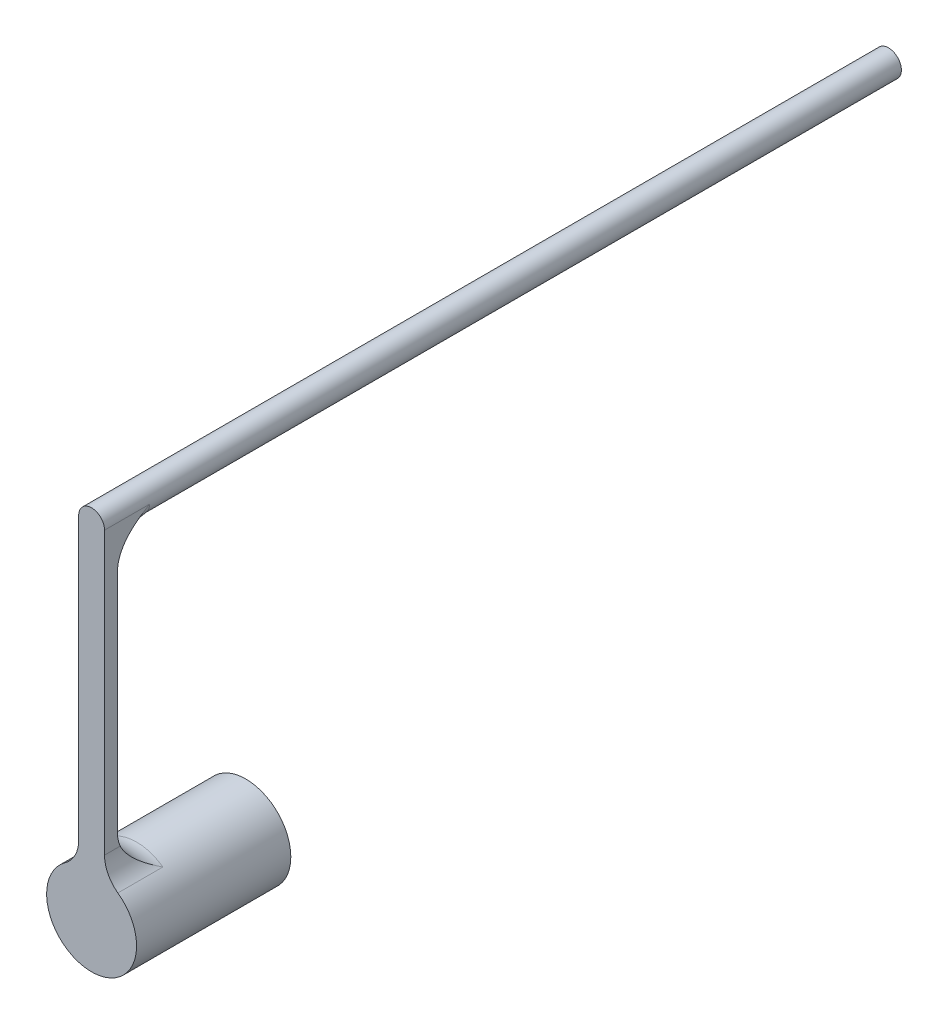
ISO-10303-21;
HEADER;
FILE_DESCRIPTION(('STEP AP214'),'2;1');
FILE_NAME('part.step','',(''),(''),'','','');
FILE_SCHEMA(('AUTOMOTIVE_DESIGN { 1 0 10303 214 1 1 1 1 }'));
ENDSEC;
DATA;
#1=APPLICATION_CONTEXT('core data for automotive mechanical design processes');
#2=APPLICATION_PROTOCOL_DEFINITION('international standard','automotive_design',2000,#1);
#3=PRODUCT_CONTEXT('',#1,'mechanical');
#4=PRODUCT('Part','Part','',(#3));
#5=PRODUCT_RELATED_PRODUCT_CATEGORY('part','',(#4));
#6=PRODUCT_DEFINITION_FORMATION('','',#4);
#7=PRODUCT_DEFINITION_CONTEXT('part definition',#1,'design');
#8=PRODUCT_DEFINITION('design','',#6,#7);
#9=PRODUCT_DEFINITION_SHAPE('','',#8);
#10=(LENGTH_UNIT() NAMED_UNIT(*) SI_UNIT(.MILLI.,.METRE.));
#11=(NAMED_UNIT(*) PLANE_ANGLE_UNIT() SI_UNIT($,.RADIAN.));
#12=(NAMED_UNIT(*) SI_UNIT($,.STERADIAN.) SOLID_ANGLE_UNIT());
#13=UNCERTAINTY_MEASURE_WITH_UNIT(LENGTH_MEASURE(1.E-05),#10,'distance_accuracy_value','');
#14=(GEOMETRIC_REPRESENTATION_CONTEXT(3) GLOBAL_UNCERTAINTY_ASSIGNED_CONTEXT((#13)) GLOBAL_UNIT_ASSIGNED_CONTEXT((#10,
#11,#12)) REPRESENTATION_CONTEXT('',''));
#15=CARTESIAN_POINT('',(0.,0.,0.));
#16=DIRECTION('',(0.,0.,1.));
#17=DIRECTION('',(1.,0.,0.));
#18=AXIS2_PLACEMENT_3D('',#15,#16,#17);
#19=CARTESIAN_POINT('',(0.,0.,22.));
#20=DIRECTION('',(0.,0.,1.));
#21=DIRECTION('',(1.,0.,0.));
#22=AXIS2_PLACEMENT_3D('',#19,#20,#21);
#23=PLANE('',#22);
#24=DIRECTION('',(0.,1.,0.));
#25=VECTOR('',#24,1.);
#26=CARTESIAN_POINT('',(-2.00951188529823,0.,22.));
#27=LINE('',#26,#25);
#28=CARTESIAN_POINT('',(-2.00951188529823,11.8305478310535,22.));
#29=VERTEX_POINT('',#28);
#30=CARTESIAN_POINT('',(-2.00951188529823,46.8162932614963,22.));
#31=VERTEX_POINT('',#30);
#32=EDGE_CURVE('E148',#29,#31,#27,.T.);
#33=ORIENTED_EDGE('',*,*,#32,.T.);
#34=CARTESIAN_POINT('',(0.,53.5315831921681,22.));
#35=DIRECTION('',(0.,0.,1.));
#36=DIRECTION('',(1.,0.,0.));
#37=AXIS2_PLACEMENT_3D('',#34,#35,#36);
#38=CIRCLE('',#37,7.00951188529823);
#39=CARTESIAN_POINT('',(2.00951188529823,46.8162932614963,22.));
#40=VERTEX_POINT('',#39);
#41=EDGE_CURVE('E70',#31,#40,#38,.T.);
#42=ORIENTED_EDGE('',*,*,#41,.T.);
#43=DIRECTION('',(0.,1.,0.));
#44=VECTOR('',#43,1.);
#45=CARTESIAN_POINT('',(2.00951188529823,0.,22.));
#46=LINE('',#45,#44);
#47=CARTESIAN_POINT('',(2.00951188529823,11.8305478310535,22.));
#48=VERTEX_POINT('',#47);
#49=EDGE_CURVE('E146',#48,#40,#46,.T.);
#50=ORIENTED_EDGE('',*,*,#49,.F.);
#51=CARTESIAN_POINT('',(0.,0.,22.));
#52=DIRECTION('',(0.,0.,1.));
#53=DIRECTION('',(1.,0.,0.));
#54=AXIS2_PLACEMENT_3D('',#51,#52,#53);
#55=CIRCLE('',#54,12.);
#56=EDGE_CURVE('E154',#48,#29,#55,.T.);
#57=ORIENTED_EDGE('',*,*,#56,.T.);
#58=EDGE_LOOP('',(#33,#42,#50,#57));
#59=FACE_BOUND('',#58,.T.);
#60=ADVANCED_FACE('F43',(#59),#23,.F.);
#61=CARTESIAN_POINT('',(0.,0.,22.));
#62=DIRECTION('',(0.,0.,-1.));
#63=DIRECTION('',(-1.,0.,0.));
#64=AXIS2_PLACEMENT_3D('',#61,#62,#63);
#65=CYLINDRICAL_SURFACE('',#64,7.);
#66=CARTESIAN_POINT('',(0.,0.,17.));
#67=DIRECTION('',(0.,0.,1.));
#68=DIRECTION('',(1.,0.,0.));
#69=AXIS2_PLACEMENT_3D('',#66,#67,#68);
#70=CIRCLE('',#69,7.);
#71=CARTESIAN_POINT('',(-4.08888193309063,5.68164100742426,17.));
#72=VERTEX_POINT('',#71);
#73=CARTESIAN_POINT('',(4.08888193309063,5.68164100742426,17.));
#74=VERTEX_POINT('',#73);
#75=EDGE_CURVE('E157',#72,#74,#70,.F.);
#76=ORIENTED_EDGE('',*,*,#75,.T.);
#77=DIRECTION('',(0.,0.,-1.));
#78=VECTOR('',#77,1.);
#79=CARTESIAN_POINT('',(4.08888193309063,5.68164100742427,22.));
#80=LINE('',#79,#78);
#81=CARTESIAN_POINT('',(4.08888193309063,5.68164100742426,24.));
#82=VERTEX_POINT('',#81);
#83=EDGE_CURVE('E220',#74,#82,#80,.F.);
#84=ORIENTED_EDGE('',*,*,#83,.T.);
#85=CARTESIAN_POINT('',(0.,0.,24.));
#86=DIRECTION('',(0.,0.,1.));
#87=DIRECTION('',(1.,0.,0.));
#88=AXIS2_PLACEMENT_3D('',#85,#86,#87);
#89=CIRCLE('',#88,7.);
#90=CARTESIAN_POINT('',(-4.08888193309063,5.68164100742426,24.));
#91=VERTEX_POINT('',#90);
#92=EDGE_CURVE('E128',#91,#82,#89,.T.);
#93=ORIENTED_EDGE('',*,*,#92,.F.);
#94=DIRECTION('',(0.,0.,-1.));
#95=VECTOR('',#94,1.);
#96=CARTESIAN_POINT('',(-4.08888193309063,5.68164100742427,22.));
#97=LINE('',#96,#95);
#98=EDGE_CURVE('E222',#91,#72,#97,.T.);
#99=ORIENTED_EDGE('',*,*,#98,.T.);
#100=EDGE_LOOP('',(#76,#84,#93,#99));
#101=FACE_BOUND('',#100,.T.);
#102=CARTESIAN_POINT('',(0.,0.,0.));
#103=DIRECTION('',(0.,0.,1.));
#104=DIRECTION('',(1.,0.,0.));
#105=AXIS2_PLACEMENT_3D('',#102,#103,#104);
#106=CIRCLE('',#105,7.);
#107=CARTESIAN_POINT('',(7.,0.,0.));
#108=VERTEX_POINT('',#107);
#109=EDGE_CURVE('E136',#108,#108,#106,.T.);
#110=ORIENTED_EDGE('',*,*,#109,.T.);
#111=EDGE_LOOP('',(#110));
#112=FACE_BOUND('',#111,.T.);
#113=ADVANCED_FACE('F234',(#101,#112),#65,.T.);
#114=CARTESIAN_POINT('',(0.,0.,0.));
#115=DIRECTION('',(0.,0.,1.));
#116=DIRECTION('',(1.,0.,0.));
#117=AXIS2_PLACEMENT_3D('',#114,#115,#116);
#118=PLANE('',#117);
#119=ORIENTED_EDGE('',*,*,#109,.F.);
#120=EDGE_LOOP('',(#119));
#121=FACE_BOUND('',#120,.T.);
#122=ADVANCED_FACE('F245',(#121),#118,.F.);
#123=CARTESIAN_POINT('',(2.00951188529823,0.,24.));
#124=DIRECTION('',(-1.,0.,0.));
#125=DIRECTION('',(0.,0.,1.));
#126=AXIS2_PLACEMENT_3D('',#123,#124,#125);
#127=PLANE('',#126);
#128=DIRECTION('',(0.,1.,0.));
#129=VECTOR('',#128,1.);
#130=CARTESIAN_POINT('',(2.00951188529823,0.,24.));
#131=LINE('',#130,#129);
#132=CARTESIAN_POINT('',(2.00951188529823,9.73995601272731,24.));
#133=VERTEX_POINT('',#132);
#134=CARTESIAN_POINT('',(2.00951188529823,53.5315831921681,24.));
#135=VERTEX_POINT('',#134);
#136=EDGE_CURVE('E115',#133,#135,#131,.T.);
#137=ORIENTED_EDGE('',*,*,#136,.F.);
#138=DIRECTION('',(0.,0.,1.));
#139=VECTOR('',#138,1.);
#140=CARTESIAN_POINT('',(2.00951188529823,9.73995601272731,17.));
#141=LINE('',#140,#139);
#142=CARTESIAN_POINT('',(2.00951188529823,9.73995601272731,21.5582187899679));
#143=VERTEX_POINT('',#142);
#144=EDGE_CURVE('E224',#133,#143,#141,.F.);
#145=ORIENTED_EDGE('',*,*,#144,.T.);
#146=CARTESIAN_POINT('',(2.00951188529823,6.70536068998866,17.));
#147=CARTESIAN_POINT('',(2.00951188529823,6.7053392372978,17.1371448207997));
#148=CARTESIAN_POINT('',(2.00951188529823,6.71125038985025,17.2742834043203));
#149=CARTESIAN_POINT('',(2.00951188529823,6.73477941582557,17.5475279949485));
#150=CARTESIAN_POINT('',(2.00951188529823,6.75239511962088,17.6836341886979));
#151=CARTESIAN_POINT('',(2.00951188529823,6.79912287511089,17.9535451484812));
#152=CARTESIAN_POINT('',(2.00951188529823,6.82820928536825,18.0873543576966));
#153=CARTESIAN_POINT('',(2.00951188529823,6.89758180299015,18.3520347887558));
#154=CARTESIAN_POINT('',(2.00951188529823,6.93786810567122,18.4829059593198));
#155=CARTESIAN_POINT('',(2.00951188529823,7.02924737732952,18.7407643921577));
#156=CARTESIAN_POINT('',(2.00951188529823,7.08033585856832,18.8677532423328));
#157=CARTESIAN_POINT('',(2.00951188529823,7.19286337114372,19.117075468538));
#158=CARTESIAN_POINT('',(2.00951188529823,7.25430623962204,19.2394070980108));
#159=CARTESIAN_POINT('',(2.00951188529823,7.45341703411276,19.5981840364216));
#160=CARTESIAN_POINT('',(2.00951188529823,7.60593380619595,19.8265979932329));
#161=CARTESIAN_POINT('',(2.00951188529823,7.94969051314372,20.2609654316838));
#162=CARTESIAN_POINT('',(2.00951188529823,8.14177251232586,20.4662477013513));
#163=CARTESIAN_POINT('',(2.00951188529823,8.55675994382166,20.8429592499007));
#164=CARTESIAN_POINT('',(2.00951188529823,8.77967275715286,21.014380398364));
#165=CARTESIAN_POINT('',(2.00951188529823,9.25778831918449,21.323924905458));
#166=CARTESIAN_POINT('',(2.00951188529823,9.51379885059548,21.4608003851049));
#167=CARTESIAN_POINT('',(2.00951188529823,10.0449650692985,21.6900621875949));
#168=CARTESIAN_POINT('',(2.00951188529823,10.3201121226781,21.7824684267044));
#169=CARTESIAN_POINT('',(2.00951188529823,10.802027551927,21.9006067844547));
#170=CARTESIAN_POINT('',(2.00951188529823,11.0060579193773,21.9378156126337));
#171=CARTESIAN_POINT('',(2.00951188529823,11.4168775839576,21.9875182635711));
#172=CARTESIAN_POINT('',(2.00951188529823,11.623663621053,22.0000390613728));
#173=CARTESIAN_POINT('',(2.00951188529823,11.8305478310535,22.));
#174=B_SPLINE_CURVE_WITH_KNOTS('',3,(#146,#147,#148,#149,#150,#151,#152,#153,#154,#155,#156,
#157,#158,#159,#160,#161,#162,#163,#164,#165,#166,#167,#168,#169,#170,#171,#172,#173),
.UNSPECIFIED.,.F.,.F.,(4,2,2,2,2,2,2,2,2,2,2,2,2,4),(0.,0.411297469220054,0.822518719074642,
1.23282589500662,1.64314022679324,2.05328442826581,2.46358095707416,3.28358677970923,
4.12328731619701,4.96318922937036,5.83009721603543,6.69661658181093,7.31738700369939,
7.93747877247301),.UNSPECIFIED.);
#175=EDGE_CURVE('E168',#143,#48,#174,.T.);
#176=ORIENTED_EDGE('',*,*,#175,.T.);
#177=ORIENTED_EDGE('',*,*,#49,.T.);
#178=CARTESIAN_POINT('',(2.00951188529823,46.8162932614963,22.));
#179=CARTESIAN_POINT('',(2.00951188529823,46.9651802013113,22.0000182785987));
#180=CARTESIAN_POINT('',(2.00951188529823,47.1140446181115,21.9938977364108));
#181=CARTESIAN_POINT('',(2.00951188529823,47.4107329238045,21.9697189781962));
#182=CARTESIAN_POINT('',(2.00951188529823,47.5585572742733,21.9516664460712));
#183=CARTESIAN_POINT('',(2.00951188529823,47.8517151594849,21.904060214657));
#184=CARTESIAN_POINT('',(2.00951188529823,47.9970563876834,21.8745536651664));
#185=CARTESIAN_POINT('',(2.00951188529823,48.285060057779,21.8044824645501));
#186=CARTESIAN_POINT('',(2.00951188529823,48.4277221328164,21.7639163106512));
#187=CARTESIAN_POINT('',(2.00951188529823,48.7195221642596,21.6690295780712));
#188=CARTESIAN_POINT('',(2.00951188529823,48.8684109899462,21.6139429385729));
#189=CARTESIAN_POINT('',(2.00951188529823,49.1615361978369,21.4924224985299));
#190=CARTESIAN_POINT('',(2.00951188529823,49.3057707144348,21.4259842134076));
#191=CARTESIAN_POINT('',(2.00951188529823,49.5889814550239,21.2825526592121));
#192=CARTESIAN_POINT('',(2.00951188529823,49.7279547518596,21.2055536215142));
#193=CARTESIAN_POINT('',(2.00951188529823,50.0001102549599,21.0419035317173));
#194=CARTESIAN_POINT('',(2.00951188529823,50.1332911674281,20.9552503384884));
#195=CARTESIAN_POINT('',(2.00951188529823,50.4579669388046,20.7281409851349));
#196=CARTESIAN_POINT('',(2.00951188529823,50.6457014970891,20.5822815329115));
#197=CARTESIAN_POINT('',(2.00951188529823,51.0072186103486,20.2741889196083));
#198=CARTESIAN_POINT('',(2.00951188529823,51.180994559566,20.1119480872389));
#199=CARTESIAN_POINT('',(2.00951188529823,51.5153895540018,19.7740207571558));
#200=CARTESIAN_POINT('',(2.00951188529823,51.6759876211979,19.5983136503671));
#201=CARTESIAN_POINT('',(2.00951188529823,51.9851171101475,19.236727798863));
#202=CARTESIAN_POINT('',(2.00951188529823,52.1336504325943,19.0508506640974));
#203=CARTESIAN_POINT('',(2.00951188529823,52.3894595171032,18.7131346800647));
#204=CARTESIAN_POINT('',(2.00951188529823,52.498657772072,18.5627345912863));
#205=CARTESIAN_POINT('',(2.00951188529823,52.7121979341951,18.2588204329733));
#206=CARTESIAN_POINT('',(2.00951188529823,52.8165457031403,18.1053104619793));
#207=CARTESIAN_POINT('',(2.00951188529823,53.0222619346161,17.7957155862569));
#208=CARTESIAN_POINT('',(2.00951188529823,53.1236214126734,17.6396247602837));
#209=CARTESIAN_POINT('',(2.00951188529823,53.3246649936266,17.3263417598605));
#210=CARTESIAN_POINT('',(2.00951188529823,53.4243488384703,17.1691494209612));
#211=CARTESIAN_POINT('',(2.00951188529823,53.5265351252475,17.0079627822383));
#212=CARTESIAN_POINT('',(2.00951188529823,53.5290591589441,17.0039813909896));
#213=CARTESIAN_POINT('',(2.00951188529823,53.5315831921681,17.));
#214=B_SPLINE_CURVE_WITH_KNOTS('',3,(#178,#179,#180,#181,#182,#183,#184,#185,#186,#187,#188,
#189,#190,#191,#192,#193,#194,#195,#196,#197,#198,#199,#200,#201,#202,#203,#204,#205,#206,#207,
#208,#209,#210,#211,#212,#213),.UNSPECIFIED.,.F.,.F.,(4,2,2,2,2,2,2,2,2,2,2,2,2,2,2,2,2,4),(0.,
0.44650168366655,0.892790825722232,1.33726199971908,1.78179359835032,2.25755403744044,
2.73350286673235,3.2097127178186,3.68602839530366,4.3980753142959,5.1104572403399,
5.82395206045977,6.53733425690686,7.09481322302693,7.65159996414811,8.20991822147486,
8.76832168779993,8.78246382342356),.UNSPECIFIED.);
#215=CARTESIAN_POINT('',(2.00951188529823,53.5315831921681,17.));
#216=VERTEX_POINT('',#215);
#217=EDGE_CURVE('E11',#40,#216,#214,.T.);
#218=ORIENTED_EDGE('',*,*,#217,.T.);
#219=DIRECTION('',(0.,0.,-1.));
#220=VECTOR('',#219,1.);
#221=CARTESIAN_POINT('',(2.00951188529823,53.5315831921681,24.));
#222=LINE('',#221,#220);
#223=EDGE_CURVE('E130',#135,#216,#222,.T.);
#224=ORIENTED_EDGE('',*,*,#223,.F.);
#225=EDGE_LOOP('',(#137,#145,#176,#177,#218,#224));
#226=FACE_BOUND('',#225,.T.);
#227=ADVANCED_FACE('F131',(#226),#127,.F.);
#228=CARTESIAN_POINT('',(0.,53.5315831921681,24.));
#229=DIRECTION('',(0.,0.,-1.));
#230=DIRECTION('',(-1.,0.,0.));
#231=AXIS2_PLACEMENT_3D('',#228,#229,#230);
#232=CYLINDRICAL_SURFACE('',#231,2.00951188529823);
#233=CARTESIAN_POINT('',(0.,53.5315831921681,17.));
#234=DIRECTION('',(0.,0.,1.));
#235=DIRECTION('',(1.,0.,0.));
#236=AXIS2_PLACEMENT_3D('',#233,#234,#235);
#237=CIRCLE('',#236,2.00951188529823);
#238=CARTESIAN_POINT('',(-2.00951188529823,53.5315831921681,17.));
#239=VERTEX_POINT('',#238);
#240=EDGE_CURVE('E191',#216,#239,#237,.F.);
#241=ORIENTED_EDGE('',*,*,#240,.T.);
#242=DIRECTION('',(0.,0.,-1.));
#243=VECTOR('',#242,1.);
#244=CARTESIAN_POINT('',(-2.00951188529823,53.5315831921681,24.));
#245=LINE('',#244,#243);
#246=CARTESIAN_POINT('',(-2.00951188529823,53.5315831921681,24.));
#247=VERTEX_POINT('',#246);
#248=EDGE_CURVE('E137',#247,#239,#245,.T.);
#249=ORIENTED_EDGE('',*,*,#248,.F.);
#250=CARTESIAN_POINT('',(0.,53.5315831921681,24.));
#251=DIRECTION('',(0.,0.,1.));
#252=DIRECTION('',(1.,0.,0.));
#253=AXIS2_PLACEMENT_3D('',#250,#251,#252);
#254=CIRCLE('',#253,2.00951188529823);
#255=EDGE_CURVE('E120',#135,#247,#254,.T.);
#256=ORIENTED_EDGE('',*,*,#255,.F.);
#257=ORIENTED_EDGE('',*,*,#223,.T.);
#258=EDGE_LOOP('',(#241,#249,#256,#257));
#259=FACE_BOUND('',#258,.T.);
#260=CARTESIAN_POINT('',(0.,53.5315831921681,-100.));
#261=DIRECTION('',(0.,0.,-1.));
#262=DIRECTION('',(-1.,0.,0.));
#263=AXIS2_PLACEMENT_3D('',#260,#261,#262);
#264=CIRCLE('',#263,2.00951188529823);
#265=CARTESIAN_POINT('',(-2.00951188529823,53.5315831921681,-100.));
#266=VERTEX_POINT('',#265);
#267=EDGE_CURVE('E149',#266,#266,#264,.T.);
#268=ORIENTED_EDGE('',*,*,#267,.F.);
#269=EDGE_LOOP('',(#268));
#270=FACE_BOUND('',#269,.T.);
#271=ADVANCED_FACE('F139',(#259,#270),#232,.T.);
#272=CARTESIAN_POINT('',(-2.00951188529823,0.,24.));
#273=DIRECTION('',(-1.,0.,0.));
#274=DIRECTION('',(0.,0.,1.));
#275=AXIS2_PLACEMENT_3D('',#272,#273,#274);
#276=PLANE('',#275);
#277=CARTESIAN_POINT('',(-2.00951188529823,11.8305478310535,22.));
#278=CARTESIAN_POINT('',(-2.00951188529823,11.6848424065092,22.0000150454789));
#279=CARTESIAN_POINT('',(-2.00951188529823,11.5391425123131,21.9938102554616));
#280=CARTESIAN_POINT('',(-2.00951188529823,11.2488011779917,21.9691100152312));
#281=CARTESIAN_POINT('',(-2.00951188529823,11.1041596400672,21.9506157155297));
#282=CARTESIAN_POINT('',(-2.00951188529823,10.8170782094431,21.9015065339501));
#283=CARTESIAN_POINT('',(-2.00951188529823,10.6746365307952,21.8709020864033));
#284=CARTESIAN_POINT('',(-2.00951188529823,10.392832289639,21.797821342587));
#285=CARTESIAN_POINT('',(-2.00951188529823,10.2534697339033,21.7553450202078));
#286=CARTESIAN_POINT('',(-2.00951188529823,9.97879409044017,21.6588348434431));
#287=CARTESIAN_POINT('',(-2.00951188529823,9.84348131351386,21.6048001045837));
#288=CARTESIAN_POINT('',(-2.00951188529823,9.57781908661484,21.4855431370995));
#289=CARTESIAN_POINT('',(-2.00951188529823,9.44747148451542,21.420316792093));
#290=CARTESIAN_POINT('',(-2.00951188529823,9.19276566106843,21.2791752251419));
#291=CARTESIAN_POINT('',(-2.00951188529823,9.06840506421996,21.2032642902871));
#292=CARTESIAN_POINT('',(-2.00951188529823,8.82646539276881,21.0412249465636));
#293=CARTESIAN_POINT('',(-2.00951188529823,8.70888868193018,20.9550930078816));
#294=CARTESIAN_POINT('',(-2.00951188529823,8.48113107775117,20.7729800472233));
#295=CARTESIAN_POINT('',(-2.00951188529823,8.37096988217411,20.6769743832205));
#296=CARTESIAN_POINT('',(-2.00951188529823,8.15920928888225,20.4759448864012));
#297=CARTESIAN_POINT('',(-2.00951188529823,8.05760974933416,20.3709212030364));
#298=CARTESIAN_POINT('',(-2.00951188529823,7.86373100063415,20.1525174819902));
#299=CARTESIAN_POINT('',(-2.00951188529823,7.77145558492566,20.039134075413));
#300=CARTESIAN_POINT('',(-2.00951188529823,7.59707008785311,19.8048669080883));
#301=CARTESIAN_POINT('',(-2.00951188529823,7.51495603560633,19.6839861050914));
#302=CARTESIAN_POINT('',(-2.00951188529823,7.36270409103407,19.437360675783));
#303=CARTESIAN_POINT('',(-2.00951188529823,7.29240738361286,19.3117141179461));
#304=CARTESIAN_POINT('',(-2.00951188529823,7.16300369273962,19.0548468624597));
#305=CARTESIAN_POINT('',(-2.00951188529823,7.10389202912837,18.9236285244775));
#306=CARTESIAN_POINT('',(-2.00951188529823,6.99743616430756,18.6566178374371));
#307=CARTESIAN_POINT('',(-2.00951188529823,6.95008266135496,18.520829201084));
#308=CARTESIAN_POINT('',(-2.00951188529823,6.86757888623074,18.2456471121353));
#309=CARTESIAN_POINT('',(-2.00951188529823,6.83242437688654,18.1062549293));
#310=CARTESIAN_POINT('',(-2.00951188529823,6.77096714994786,17.8067515847155));
#311=CARTESIAN_POINT('',(-2.00951188529823,6.7463871114314,17.6462837264975));
#312=CARTESIAN_POINT('',(-2.00951188529823,6.71357144322234,17.323876643618));
#313=CARTESIAN_POINT('',(-2.00951188529823,6.70531682590295,17.1619393485955));
#314=CARTESIAN_POINT('',(-2.00951188529823,6.70536068998866,17.));
#315=B_SPLINE_CURVE_WITH_KNOTS('',3,(#277,#278,#279,#280,#281,#282,#283,#284,#285,#286,#287,
#288,#289,#290,#291,#292,#293,#294,#295,#296,#297,#298,#299,#300,#301,#302,#303,#304,#305,#306,
#307,#308,#309,#310,#311,#312,#313,#314),.UNSPECIFIED.,.F.,.F.,(4,2,2,2,2,2,2,2,2,2,2,2,2,2,2,2,
2,2,4),(0.,0.436976283398089,0.873911663992481,1.31047138974169,1.74703207561416,
2.18362617996365,2.62038121346726,3.05696150011656,3.49369300052695,3.93154220155706,
4.36938414770467,4.80740351505567,5.2452511679181,5.67663911618605,6.10784615763691,
6.53871098160111,6.96942599974092,7.45560207086539,7.94121235129992),.UNSPECIFIED.);
#316=CARTESIAN_POINT('',(-2.00951188529823,9.73995601272686,21.5582187899677));
#317=VERTEX_POINT('',#316);
#318=EDGE_CURVE('E159',#29,#317,#315,.T.);
#319=ORIENTED_EDGE('',*,*,#318,.T.);
#320=DIRECTION('',(0.,0.,-1.));
#321=VECTOR('',#320,1.);
#322=CARTESIAN_POINT('',(-2.00951188529823,9.73995601272731,24.));
#323=LINE('',#322,#321);
#324=CARTESIAN_POINT('',(-2.00951188529823,9.73995601272731,24.));
#325=VERTEX_POINT('',#324);
#326=EDGE_CURVE('E218',#317,#325,#323,.F.);
#327=ORIENTED_EDGE('',*,*,#326,.T.);
#328=DIRECTION('',(0.,1.,0.));
#329=VECTOR('',#328,1.);
#330=CARTESIAN_POINT('',(-2.00951188529823,0.,24.));
#331=LINE('',#330,#329);
#332=EDGE_CURVE('E141',#325,#247,#331,.T.);
#333=ORIENTED_EDGE('',*,*,#332,.T.);
#334=ORIENTED_EDGE('',*,*,#248,.T.);
#335=CARTESIAN_POINT('',(-2.00951188529823,46.8162932614963,22.));
#336=CARTESIAN_POINT('',(-2.00951188529823,46.9651802013113,22.0000182785987));
#337=CARTESIAN_POINT('',(-2.00951188529823,47.1140446181115,21.9938977364108));
#338=CARTESIAN_POINT('',(-2.00951188529823,47.4107329238045,21.9697189781962));
#339=CARTESIAN_POINT('',(-2.00951188529823,47.5585572742733,21.9516664460712));
#340=CARTESIAN_POINT('',(-2.00951188529823,47.8517151594849,21.904060214657));
#341=CARTESIAN_POINT('',(-2.00951188529823,47.9970563876834,21.8745536651664));
#342=CARTESIAN_POINT('',(-2.00951188529823,48.285060057779,21.8044824645501));
#343=CARTESIAN_POINT('',(-2.00951188529823,48.4277221328164,21.7639163106512));
#344=CARTESIAN_POINT('',(-2.00951188529823,48.7195221642596,21.6690295780712));
#345=CARTESIAN_POINT('',(-2.00951188529823,48.8684109899462,21.6139429385729));
#346=CARTESIAN_POINT('',(-2.00951188529823,49.1615361978369,21.4924224985299));
#347=CARTESIAN_POINT('',(-2.00951188529823,49.3057707144348,21.4259842134076));
#348=CARTESIAN_POINT('',(-2.00951188529823,49.5889814550239,21.2825526592121));
#349=CARTESIAN_POINT('',(-2.00951188529823,49.7279547518596,21.2055536215142));
#350=CARTESIAN_POINT('',(-2.00951188529823,50.0001102549599,21.0419035317173));
#351=CARTESIAN_POINT('',(-2.00951188529823,50.1332911674281,20.9552503384884));
#352=CARTESIAN_POINT('',(-2.00951188529823,50.4579669388046,20.7281409851349));
#353=CARTESIAN_POINT('',(-2.00951188529823,50.6457014970891,20.5822815329115));
#354=CARTESIAN_POINT('',(-2.00951188529823,51.0072186103486,20.2741889196083));
#355=CARTESIAN_POINT('',(-2.00951188529823,51.180994559566,20.1119480872389));
#356=CARTESIAN_POINT('',(-2.00951188529823,51.5153895540018,19.7740207571558));
#357=CARTESIAN_POINT('',(-2.00951188529823,51.6759876211979,19.5983136503671));
#358=CARTESIAN_POINT('',(-2.00951188529823,51.9851171101475,19.236727798863));
#359=CARTESIAN_POINT('',(-2.00951188529823,52.1336504325943,19.0508506640974));
#360=CARTESIAN_POINT('',(-2.00951188529823,52.3894595171032,18.7131346800647));
#361=CARTESIAN_POINT('',(-2.00951188529823,52.498657772072,18.5627345912863));
#362=CARTESIAN_POINT('',(-2.00951188529823,52.7121979341951,18.2588204329733));
#363=CARTESIAN_POINT('',(-2.00951188529823,52.8165457031403,18.1053104619793));
#364=CARTESIAN_POINT('',(-2.00951188529823,53.0222619346161,17.7957155862569));
#365=CARTESIAN_POINT('',(-2.00951188529823,53.1236214126734,17.6396247602837));
#366=CARTESIAN_POINT('',(-2.00951188529823,53.3246649936266,17.3263417598605));
#367=CARTESIAN_POINT('',(-2.00951188529823,53.4243488384703,17.1691494209612));
#368=CARTESIAN_POINT('',(-2.00951188529823,53.5265351252475,17.0079627822383));
#369=CARTESIAN_POINT('',(-2.00951188529823,53.5290591589441,17.0039813909896));
#370=CARTESIAN_POINT('',(-2.00951188529823,53.5315831921681,17.));
#371=B_SPLINE_CURVE_WITH_KNOTS('',3,(#335,#336,#337,#338,#339,#340,#341,#342,#343,#344,#345,
#346,#347,#348,#349,#350,#351,#352,#353,#354,#355,#356,#357,#358,#359,#360,#361,#362,#363,#364,
#365,#366,#367,#368,#369,#370),.UNSPECIFIED.,.F.,.F.,(4,2,2,2,2,2,2,2,2,2,2,2,2,2,2,2,2,4),(0.,
0.44650168366655,0.892790825722232,1.33726199971908,1.78179359835032,2.25755403744044,
2.73350286673235,3.2097127178186,3.68602839530366,4.3980753142959,5.1104572403399,
5.82395206045977,6.53733425690686,7.09481322302693,7.65159996414811,8.20991822147486,
8.76832168779993,8.78246382342356),.UNSPECIFIED.);
#372=EDGE_CURVE('E57',#239,#31,#371,.F.);
#373=ORIENTED_EDGE('',*,*,#372,.T.);
#374=ORIENTED_EDGE('',*,*,#32,.F.);
#375=EDGE_LOOP('',(#319,#327,#333,#334,#373,#374));
#376=FACE_BOUND('',#375,.T.);
#377=ADVANCED_FACE('F178',(#376),#276,.T.);
#378=CARTESIAN_POINT('',(0.,0.,24.));
#379=DIRECTION('',(0.,0.,1.));
#380=DIRECTION('',(1.,0.,0.));
#381=AXIS2_PLACEMENT_3D('',#378,#379,#380);
#382=PLANE('',#381);
#383=ORIENTED_EDGE('',*,*,#332,.F.);
#384=CARTESIAN_POINT('',(-7.00951188529823,9.73995601272731,24.));
#385=DIRECTION('',(0.,0.,1.));
#386=DIRECTION('',(1.,0.,0.));
#387=AXIS2_PLACEMENT_3D('',#384,#385,#386);
#388=CIRCLE('',#387,5.);
#389=EDGE_CURVE('E193',#325,#91,#388,.F.);
#390=ORIENTED_EDGE('',*,*,#389,.T.);
#391=ORIENTED_EDGE('',*,*,#92,.T.);
#392=CARTESIAN_POINT('',(7.00951188529823,9.73995601272731,24.));
#393=DIRECTION('',(0.,0.,1.));
#394=DIRECTION('',(1.,0.,0.));
#395=AXIS2_PLACEMENT_3D('',#392,#393,#394);
#396=CIRCLE('',#395,5.);
#397=EDGE_CURVE('E124',#82,#133,#396,.F.);
#398=ORIENTED_EDGE('',*,*,#397,.T.);
#399=ORIENTED_EDGE('',*,*,#136,.T.);
#400=ORIENTED_EDGE('',*,*,#255,.T.);
#401=EDGE_LOOP('',(#383,#390,#391,#398,#399,#400));
#402=FACE_BOUND('',#401,.T.);
#403=ADVANCED_FACE('F118',(#402),#382,.T.);
#404=CARTESIAN_POINT('',(0.,0.,17.));
#405=DIRECTION('',(0.,0.,1.));
#406=DIRECTION('',(1.,0.,0.));
#407=AXIS2_PLACEMENT_3D('',#404,#405,#406);
#408=TOROIDAL_SURFACE('',#407,12.,5.);
#409=ORIENTED_EDGE('',*,*,#175,.F.);
#410=CARTESIAN_POINT('',(2.00951188529823,9.73995601272731,21.5582187899679));
#411=CARTESIAN_POINT('',(2.00950388365162,9.60190506149211,21.4973103478148));
#412=CARTESIAN_POINT('',(2.01522644193257,9.46649540928433,21.4308227873632));
#413=CARTESIAN_POINT('',(2.03676454705383,9.20208573145015,21.2882333926709));
#414=CARTESIAN_POINT('',(2.05255477282021,9.07307049814632,21.2121560615873));
#415=CARTESIAN_POINT('',(2.09261997709013,8.82345668709834,21.0526217647854));
#416=CARTESIAN_POINT('',(2.11678574625915,8.70277266147484,20.9692696455501));
#417=CARTESIAN_POINT('',(2.17243964313968,8.46823844135109,20.7955602977348));
#418=CARTESIAN_POINT('',(2.20393323961557,8.35439343104827,20.7051978710953));
#419=CARTESIAN_POINT('',(2.28670959510225,8.09038763141767,20.4820763539142));
#420=CARTESIAN_POINT('',(2.34091233667395,7.9434626176218,20.3465712349008));
#421=CARTESIAN_POINT('',(2.45898761917344,7.6624648832512,20.0667913454866));
#422=CARTESIAN_POINT('',(2.52286351368625,7.52839664642246,19.9225135441073));
#423=CARTESIAN_POINT('',(2.65883874532523,7.27158493147301,19.6265382088195));
#424=CARTESIAN_POINT('',(2.73097738486079,7.14890106517497,19.4748073549873));
#425=CARTESIAN_POINT('',(2.88193384275659,6.91462176486316,19.1663235778512));
#426=CARTESIAN_POINT('',(2.96074990137505,6.80302342614989,19.0095719844247));
#427=CARTESIAN_POINT('',(3.11912587325015,6.596592457812,18.7023496324101));
#428=CARTESIAN_POINT('',(3.19832759831602,6.50114690380075,18.5521034422174));
#429=CARTESIAN_POINT('',(3.36135550782434,6.31856715498255,18.2496234610577));
#430=CARTESIAN_POINT('',(3.44517172835036,6.23141608167781,18.0973944555821));
#431=CARTESIAN_POINT('',(3.61829910620442,6.06377014269454,17.7899157149148));
#432=CARTESIAN_POINT('',(3.7076573282124,5.98335165185525,17.6346510010321));
#433=CARTESIAN_POINT('',(3.891159955579,5.82968691248015,17.3233333034608));
#434=CARTESIAN_POINT('',(3.98530546605214,5.75644233151823,17.1672801453216));
#435=CARTESIAN_POINT('',(4.08423852725511,5.68498573948496,17.0074926757898));
#436=CARTESIAN_POINT('',(4.0865595182919,5.68331237620615,17.0037463317381));
#437=CARTESIAN_POINT('',(4.08888193309063,5.68164100742426,17.));
#438=B_SPLINE_CURVE_WITH_KNOTS('',3,(#410,#411,#412,#413,#414,#415,#416,#417,#418,#419,#420,
#421,#422,#423,#424,#425,#426,#427,#428,#429,#430,#431,#432,#433,#434,#435,#436,#437),
.UNSPECIFIED.,.F.,.F.,(4,2,2,2,2,2,2,2,2,2,2,2,2,4),(0.,0.452199838485203,0.903266816817672,
1.34866078229855,1.79438821795221,2.41465272074847,3.03513275741433,3.65869737231751,
4.28209816351002,4.86631213768503,5.4493106658209,6.03821526553304,6.62725643272655,
6.64139857026985),.UNSPECIFIED.);
#439=EDGE_CURVE('E211',#143,#74,#438,.T.);
#440=ORIENTED_EDGE('',*,*,#439,.T.);
#441=ORIENTED_EDGE('',*,*,#75,.F.);
#442=CARTESIAN_POINT('',(-2.00951188529823,9.73995601272731,21.5582187899677));
#443=CARTESIAN_POINT('',(-2.00950388365162,9.60190506149202,21.4973103478147));
#444=CARTESIAN_POINT('',(-2.01522644193258,9.46649540928419,21.4308227873631));
#445=CARTESIAN_POINT('',(-2.03676454705386,9.20208573144993,21.2882333926708));
#446=CARTESIAN_POINT('',(-2.05255477282024,9.07307049814608,21.2121560615872));
#447=CARTESIAN_POINT('',(-2.09261997709017,8.82345668709811,21.0526217647853));
#448=CARTESIAN_POINT('',(-2.11678574625919,8.70277266147465,20.9692696455499));
#449=CARTESIAN_POINT('',(-2.17243964313971,8.46823844135096,20.7955602977347));
#450=CARTESIAN_POINT('',(-2.2039332396156,8.35439343104819,20.7051978710953));
#451=CARTESIAN_POINT('',(-2.28670959510227,8.09038763141763,20.4820763539141));
#452=CARTESIAN_POINT('',(-2.34091233667396,7.94346261762178,20.3465712349008));
#453=CARTESIAN_POINT('',(-2.45898761917343,7.66246488325122,20.0667913454866));
#454=CARTESIAN_POINT('',(-2.52286351368623,7.5283966464225,19.9225135441074));
#455=CARTESIAN_POINT('',(-2.65883874532522,7.27158493147303,19.6265382088195));
#456=CARTESIAN_POINT('',(-2.7309773848608,7.14890106517497,19.4748073549874));
#457=CARTESIAN_POINT('',(-2.8819338427566,6.91462176486314,19.1663235778512));
#458=CARTESIAN_POINT('',(-2.96074990137504,6.80302342614988,19.0095719844246));
#459=CARTESIAN_POINT('',(-3.11912587325024,6.59659245781191,18.70234963241));
#460=CARTESIAN_POINT('',(-3.19832759831622,6.50114690380058,18.5521034422174));
#461=CARTESIAN_POINT('',(-3.36135550782424,6.3185671549826,18.2496234610575));
#462=CARTESIAN_POINT('',(-3.44517172834987,6.23141608167815,18.0973944555815));
#463=CARTESIAN_POINT('',(-3.61829910620497,6.06377014269414,17.7899157149153));
#464=CARTESIAN_POINT('',(-3.70765732821442,5.98335165185379,17.634651001034));
#465=CARTESIAN_POINT('',(-3.891159955577,5.8296869124816,17.3233333034589));
#466=CARTESIAN_POINT('',(-3.98530546604465,5.75644233152364,17.1672801453145));
#467=CARTESIAN_POINT('',(-4.08423852725476,5.68498573948522,17.0074926757895));
#468=CARTESIAN_POINT('',(-4.08655951829171,5.68331237620628,17.0037463317379));
#469=CARTESIAN_POINT('',(-4.08888193309063,5.68164100742426,17.));
#470=B_SPLINE_CURVE_WITH_KNOTS('',3,(#442,#443,#444,#445,#446,#447,#448,#449,#450,#451,#452,
#453,#454,#455,#456,#457,#458,#459,#460,#461,#462,#463,#464,#465,#466,#467,#468,#469),
.UNSPECIFIED.,.F.,.F.,(4,2,2,2,2,2,2,2,2,2,2,2,2,4),(0.,0.452199838485323,0.903266816817903,
1.34866078229865,1.7943882179522,2.41465272074838,3.03513275741417,3.65869737231744,
4.28209816351005,4.86631213768508,5.44931066582087,6.03821526553296,6.62725643272647,
6.64139857026977),.UNSPECIFIED.);
#471=EDGE_CURVE('E195',#72,#317,#470,.F.);
#472=ORIENTED_EDGE('',*,*,#471,.T.);
#473=ORIENTED_EDGE('',*,*,#318,.F.);
#474=ORIENTED_EDGE('',*,*,#56,.F.);
#475=EDGE_LOOP('',(#409,#440,#441,#472,#473,#474));
#476=FACE_BOUND('',#475,.T.);
#477=ADVANCED_FACE('F174',(#476),#408,.F.);
#478=CARTESIAN_POINT('',(7.00951188529823,9.73995601272731,22.));
#479=DIRECTION('',(0.,0.,-1.));
#480=DIRECTION('',(-1.,0.,0.));
#481=AXIS2_PLACEMENT_3D('',#478,#479,#480);
#482=CYLINDRICAL_SURFACE('',#481,5.);
#483=ORIENTED_EDGE('',*,*,#397,.F.);
#484=ORIENTED_EDGE('',*,*,#83,.F.);
#485=ORIENTED_EDGE('',*,*,#439,.F.);
#486=ORIENTED_EDGE('',*,*,#144,.F.);
#487=EDGE_LOOP('',(#483,#484,#485,#486));
#488=FACE_BOUND('',#487,.T.);
#489=ADVANCED_FACE('F206',(#488),#482,.F.);
#490=CARTESIAN_POINT('',(-7.00951188529823,9.73995601272731,22.));
#491=DIRECTION('',(0.,0.,-1.));
#492=DIRECTION('',(-1.,0.,0.));
#493=AXIS2_PLACEMENT_3D('',#490,#491,#492);
#494=CYLINDRICAL_SURFACE('',#493,5.);
#495=ORIENTED_EDGE('',*,*,#389,.F.);
#496=ORIENTED_EDGE('',*,*,#326,.F.);
#497=ORIENTED_EDGE('',*,*,#471,.F.);
#498=ORIENTED_EDGE('',*,*,#98,.F.);
#499=EDGE_LOOP('',(#495,#496,#497,#498));
#500=FACE_BOUND('',#499,.T.);
#501=ADVANCED_FACE('F202',(#500),#494,.F.);
#502=CARTESIAN_POINT('',(0.,53.5315831921681,-100.));
#503=DIRECTION('',(0.,0.,-1.));
#504=DIRECTION('',(-1.,0.,0.));
#505=AXIS2_PLACEMENT_3D('',#502,#503,#504);
#506=PLANE('',#505);
#507=ORIENTED_EDGE('',*,*,#267,.T.);
#508=EDGE_LOOP('',(#507));
#509=FACE_BOUND('',#508,.T.);
#510=ADVANCED_FACE('F205',(#509),#506,.T.);
#511=CARTESIAN_POINT('',(0.,53.5315831921681,17.));
#512=DIRECTION('',(0.,0.,1.));
#513=DIRECTION('',(1.,0.,0.));
#514=AXIS2_PLACEMENT_3D('',#511,#512,#513);
#515=TOROIDAL_SURFACE('',#514,7.00951188529823,5.);
#516=ORIENTED_EDGE('',*,*,#217,.F.);
#517=ORIENTED_EDGE('',*,*,#41,.F.);
#518=ORIENTED_EDGE('',*,*,#372,.F.);
#519=ORIENTED_EDGE('',*,*,#240,.F.);
#520=EDGE_LOOP('',(#516,#517,#518,#519));
#521=FACE_BOUND('',#520,.T.);
#522=ADVANCED_FACE('F45',(#521),#515,.F.);
#523=CLOSED_SHELL('',(#60,#113,#122,#227,#271,#377,#403,#477,#489,#501,#510,#522));
#524=MANIFOLD_SOLID_BREP('B2',#523);
#525=ADVANCED_BREP_SHAPE_REPRESENTATION('',(#18,#524),#14);
#526=SHAPE_DEFINITION_REPRESENTATION(#9,#525);
ENDSEC;
END-ISO-10303-21;
